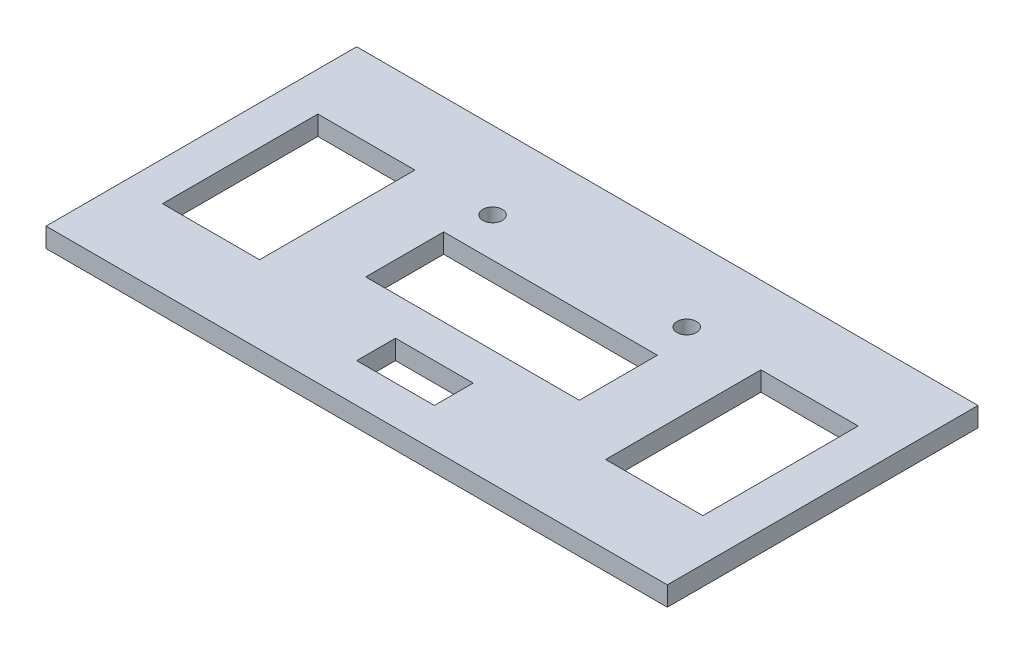
ISO-10303-21;
HEADER;
FILE_DESCRIPTION(('STEP AP214'),'2;1');
FILE_NAME('part.step','',(''),(''),'','','');
FILE_SCHEMA(('AUTOMOTIVE_DESIGN { 1 0 10303 214 1 1 1 1 }'));
ENDSEC;
DATA;
#1=APPLICATION_CONTEXT('core data for automotive mechanical design processes');
#2=APPLICATION_PROTOCOL_DEFINITION('international standard','automotive_design',2000,#1);
#3=PRODUCT_CONTEXT('',#1,'mechanical');
#4=PRODUCT('Part','Part','',(#3));
#5=PRODUCT_RELATED_PRODUCT_CATEGORY('part','',(#4));
#6=PRODUCT_DEFINITION_FORMATION('','',#4);
#7=PRODUCT_DEFINITION_CONTEXT('part definition',#1,'design');
#8=PRODUCT_DEFINITION('design','',#6,#7);
#9=PRODUCT_DEFINITION_SHAPE('','',#8);
#10=(LENGTH_UNIT() NAMED_UNIT(*) SI_UNIT(.MILLI.,.METRE.));
#11=(NAMED_UNIT(*) PLANE_ANGLE_UNIT() SI_UNIT($,.RADIAN.));
#12=(NAMED_UNIT(*) SI_UNIT($,.STERADIAN.) SOLID_ANGLE_UNIT());
#13=UNCERTAINTY_MEASURE_WITH_UNIT(LENGTH_MEASURE(1.E-05),#10,'distance_accuracy_value','');
#14=(GEOMETRIC_REPRESENTATION_CONTEXT(3) GLOBAL_UNCERTAINTY_ASSIGNED_CONTEXT((#13)) GLOBAL_UNIT_ASSIGNED_CONTEXT((#10,
#11,#12)) REPRESENTATION_CONTEXT('',''));
#15=CARTESIAN_POINT('',(0.,0.,0.));
#16=DIRECTION('',(0.,0.,1.));
#17=DIRECTION('',(1.,0.,0.));
#18=AXIS2_PLACEMENT_3D('',#15,#16,#17);
#19=CARTESIAN_POINT('',(0.,6.35,0.));
#20=DIRECTION('',(0.,-1.,0.));
#21=DIRECTION('',(0.,0.,-1.));
#22=AXIS2_PLACEMENT_3D('',#19,#20,#21);
#23=PLANE('',#22);
#24=DIRECTION('',(1.,0.,0.));
#25=VECTOR('',#24,1.);
#26=CARTESIAN_POINT('',(88.9,6.35,-12.7));
#27=LINE('',#26,#25);
#28=CARTESIAN_POINT('',(88.9,6.35,-12.7));
#29=VERTEX_POINT('',#28);
#30=CARTESIAN_POINT('',(114.3,6.35,-12.7));
#31=VERTEX_POINT('',#30);
#32=EDGE_CURVE('E183',#29,#31,#27,.T.);
#33=ORIENTED_EDGE('',*,*,#32,.F.);
#34=DIRECTION('',(0.,0.,1.));
#35=VECTOR('',#34,1.);
#36=CARTESIAN_POINT('',(88.9,6.35,-25.4));
#37=LINE('',#36,#35);
#38=CARTESIAN_POINT('',(88.9,6.35,-25.4));
#39=VERTEX_POINT('',#38);
#40=EDGE_CURVE('E50',#39,#29,#37,.T.);
#41=ORIENTED_EDGE('',*,*,#40,.F.);
#42=DIRECTION('',(-1.,0.,0.));
#43=VECTOR('',#42,1.);
#44=CARTESIAN_POINT('',(88.9,6.35,-25.4));
#45=LINE('',#44,#43);
#46=CARTESIAN_POINT('',(114.3,6.35,-25.4));
#47=VERTEX_POINT('',#46);
#48=EDGE_CURVE('E189',#47,#39,#45,.T.);
#49=ORIENTED_EDGE('',*,*,#48,.F.);
#50=DIRECTION('',(0.,0.,-1.));
#51=VECTOR('',#50,1.);
#52=CARTESIAN_POINT('',(114.3,6.35,-25.4));
#53=LINE('',#52,#51);
#54=EDGE_CURVE('E174',#31,#47,#53,.T.);
#55=ORIENTED_EDGE('',*,*,#54,.F.);
#56=EDGE_LOOP('',(#33,#41,#49,#55));
#57=FACE_BOUND('',#56,.T.);
#58=DIRECTION('',(1.,0.,0.));
#59=VECTOR('',#58,1.);
#60=CARTESIAN_POINT('',(66.6673608919091,6.35,-37.8867631456359));
#61=LINE('',#60,#59);
#62=CARTESIAN_POINT('',(66.6673608919091,6.35,-37.8867631456359));
#63=VERTEX_POINT('',#62);
#64=CARTESIAN_POINT('',(136.542227913672,6.35,-37.8867631456359));
#65=VERTEX_POINT('',#64);
#66=EDGE_CURVE('E200',#63,#65,#61,.T.);
#67=ORIENTED_EDGE('',*,*,#66,.F.);
#68=DIRECTION('',(0.,0.,1.));
#69=VECTOR('',#68,1.);
#70=CARTESIAN_POINT('',(66.6673608919091,6.35,-63.3958860848054));
#71=LINE('',#70,#69);
#72=CARTESIAN_POINT('',(66.6673608919091,6.35,-63.3958860848054));
#73=VERTEX_POINT('',#72);
#74=EDGE_CURVE('E196',#73,#63,#71,.T.);
#75=ORIENTED_EDGE('',*,*,#74,.F.);
#76=DIRECTION('',(1.,0.,0.));
#77=VECTOR('',#76,1.);
#78=CARTESIAN_POINT('',(66.6673608919091,6.35,-63.3958860848054));
#79=LINE('',#78,#77);
#80=CARTESIAN_POINT('',(136.542227913672,6.35,-63.3958860848054));
#81=VERTEX_POINT('',#80);
#82=EDGE_CURVE('E206',#73,#81,#79,.T.);
#83=ORIENTED_EDGE('',*,*,#82,.T.);
#84=DIRECTION('',(0.,0.,1.));
#85=VECTOR('',#84,1.);
#86=CARTESIAN_POINT('',(136.542227913672,6.35,-63.3958860848054));
#87=LINE('',#86,#85);
#88=EDGE_CURVE('E203',#81,#65,#87,.T.);
#89=ORIENTED_EDGE('',*,*,#88,.T.);
#90=EDGE_LOOP('',(#67,#75,#83,#89));
#91=FACE_BOUND('',#90,.T.);
#92=CARTESIAN_POINT('',(69.85,6.35,-76.2));
#93=DIRECTION('',(0.,1.,0.));
#94=DIRECTION('',(0.,0.,1.));
#95=AXIS2_PLACEMENT_3D('',#92,#93,#94);
#96=CIRCLE('',#95,3.175);
#97=CARTESIAN_POINT('',(69.85,6.35,-73.025));
#98=VERTEX_POINT('',#97);
#99=EDGE_CURVE('E219',#98,#98,#96,.T.);
#100=ORIENTED_EDGE('',*,*,#99,.F.);
#101=EDGE_LOOP('',(#100));
#102=FACE_BOUND('',#101,.T.);
#103=CARTESIAN_POINT('',(133.35,6.35,-76.2));
#104=DIRECTION('',(0.,1.,0.));
#105=DIRECTION('',(0.,0.,1.));
#106=AXIS2_PLACEMENT_3D('',#103,#104,#105);
#107=CIRCLE('',#106,3.175);
#108=CARTESIAN_POINT('',(133.35,6.35,-73.025));
#109=VERTEX_POINT('',#108);
#110=EDGE_CURVE('E212',#109,#109,#107,.T.);
#111=ORIENTED_EDGE('',*,*,#110,.F.);
#112=EDGE_LOOP('',(#111));
#113=FACE_BOUND('',#112,.T.);
#114=DIRECTION('',(0.,0.,1.));
#115=VECTOR('',#114,1.);
#116=CARTESIAN_POINT('',(12.7,6.35,-76.2));
#117=LINE('',#116,#115);
#118=CARTESIAN_POINT('',(12.7,6.35,-76.2));
#119=VERTEX_POINT('',#118);
#120=CARTESIAN_POINT('',(12.7,6.35,-25.4));
#121=VERTEX_POINT('',#120);
#122=EDGE_CURVE('E258',#119,#121,#117,.T.);
#123=ORIENTED_EDGE('',*,*,#122,.F.);
#124=DIRECTION('',(-1.,0.,0.));
#125=VECTOR('',#124,1.);
#126=CARTESIAN_POINT('',(12.7,6.35,-76.2));
#127=LINE('',#126,#125);
#128=CARTESIAN_POINT('',(44.45,6.35,-76.2));
#129=VERTEX_POINT('',#128);
#130=EDGE_CURVE('E266',#129,#119,#127,.T.);
#131=ORIENTED_EDGE('',*,*,#130,.F.);
#132=DIRECTION('',(0.,0.,-1.));
#133=VECTOR('',#132,1.);
#134=CARTESIAN_POINT('',(44.45,6.35,-76.2));
#135=LINE('',#134,#133);
#136=CARTESIAN_POINT('',(44.45,6.35,-25.4));
#137=VERTEX_POINT('',#136);
#138=EDGE_CURVE('E263',#137,#129,#135,.T.);
#139=ORIENTED_EDGE('',*,*,#138,.F.);
#140=DIRECTION('',(1.,0.,0.));
#141=VECTOR('',#140,1.);
#142=CARTESIAN_POINT('',(12.7,6.35,-25.4));
#143=LINE('',#142,#141);
#144=EDGE_CURVE('E260',#121,#137,#143,.T.);
#145=ORIENTED_EDGE('',*,*,#144,.F.);
#146=EDGE_LOOP('',(#123,#131,#139,#145));
#147=FACE_BOUND('',#146,.T.);
#148=DIRECTION('',(0.,0.,1.));
#149=VECTOR('',#148,1.);
#150=CARTESIAN_POINT('',(0.,6.35,0.));
#151=LINE('',#150,#149);
#152=CARTESIAN_POINT('',(0.,6.35,-101.6));
#153=VERTEX_POINT('',#152);
#154=CARTESIAN_POINT('',(0.,6.35,0.));
#155=VERTEX_POINT('',#154);
#156=EDGE_CURVE('E289',#153,#155,#151,.T.);
#157=ORIENTED_EDGE('',*,*,#156,.T.);
#158=DIRECTION('',(1.,0.,0.));
#159=VECTOR('',#158,1.);
#160=CARTESIAN_POINT('',(0.,6.35,0.));
#161=LINE('',#160,#159);
#162=CARTESIAN_POINT('',(203.2,6.35,0.));
#163=VERTEX_POINT('',#162);
#164=EDGE_CURVE('E292',#155,#163,#161,.T.);
#165=ORIENTED_EDGE('',*,*,#164,.T.);
#166=DIRECTION('',(0.,0.,-1.));
#167=VECTOR('',#166,1.);
#168=CARTESIAN_POINT('',(203.2,6.35,0.));
#169=LINE('',#168,#167);
#170=CARTESIAN_POINT('',(203.2,6.35,-101.6));
#171=VERTEX_POINT('',#170);
#172=EDGE_CURVE('E295',#163,#171,#169,.T.);
#173=ORIENTED_EDGE('',*,*,#172,.T.);
#174=DIRECTION('',(-1.,0.,0.));
#175=VECTOR('',#174,1.);
#176=CARTESIAN_POINT('',(0.,6.35,-101.6));
#177=LINE('',#176,#175);
#178=EDGE_CURVE('E297',#171,#153,#177,.T.);
#179=ORIENTED_EDGE('',*,*,#178,.T.);
#180=EDGE_LOOP('',(#157,#165,#173,#179));
#181=FACE_BOUND('',#180,.T.);
#182=DIRECTION('',(0.,0.,-1.));
#183=VECTOR('',#182,1.);
#184=CARTESIAN_POINT('',(189.416375643468,6.35,-76.2));
#185=LINE('',#184,#183);
#186=CARTESIAN_POINT('',(189.416375643468,6.35,-25.4));
#187=VERTEX_POINT('',#186);
#188=CARTESIAN_POINT('',(189.416375643468,6.35,-76.2));
#189=VERTEX_POINT('',#188);
#190=EDGE_CURVE('E225',#187,#189,#185,.T.);
#191=ORIENTED_EDGE('',*,*,#190,.F.);
#192=DIRECTION('',(1.,0.,0.));
#193=VECTOR('',#192,1.);
#194=CARTESIAN_POINT('',(189.416375643468,6.35,-25.4));
#195=LINE('',#194,#193);
#196=CARTESIAN_POINT('',(157.607444145469,6.35,-25.4));
#197=VERTEX_POINT('',#196);
#198=EDGE_CURVE('E233',#197,#187,#195,.T.);
#199=ORIENTED_EDGE('',*,*,#198,.F.);
#200=DIRECTION('',(0.,0.,1.));
#201=VECTOR('',#200,1.);
#202=CARTESIAN_POINT('',(157.607444145469,6.35,-76.2));
#203=LINE('',#202,#201);
#204=CARTESIAN_POINT('',(157.607444145469,6.35,-76.2));
#205=VERTEX_POINT('',#204);
#206=EDGE_CURVE('E230',#205,#197,#203,.T.);
#207=ORIENTED_EDGE('',*,*,#206,.F.);
#208=DIRECTION('',(-1.,0.,0.));
#209=VECTOR('',#208,1.);
#210=CARTESIAN_POINT('',(189.416375643468,6.35,-76.2));
#211=LINE('',#210,#209);
#212=EDGE_CURVE('E227',#189,#205,#211,.T.);
#213=ORIENTED_EDGE('',*,*,#212,.F.);
#214=EDGE_LOOP('',(#191,#199,#207,#213));
#215=FACE_BOUND('',#214,.T.);
#216=ADVANCED_FACE('F35',(#57,#91,#102,#113,#147,#181,#215),#23,.F.);
#217=CARTESIAN_POINT('',(0.,0.,0.));
#218=DIRECTION('',(0.,-1.,0.));
#219=DIRECTION('',(0.,0.,-1.));
#220=AXIS2_PLACEMENT_3D('',#217,#218,#219);
#221=PLANE('',#220);
#222=DIRECTION('',(0.,0.,-1.));
#223=VECTOR('',#222,1.);
#224=CARTESIAN_POINT('',(88.9,0.,0.));
#225=LINE('',#224,#223);
#226=CARTESIAN_POINT('',(88.9,0.,-12.7));
#227=VERTEX_POINT('',#226);
#228=CARTESIAN_POINT('',(88.9,0.,-25.4));
#229=VERTEX_POINT('',#228);
#230=EDGE_CURVE('E11',#227,#229,#225,.T.);
#231=ORIENTED_EDGE('',*,*,#230,.F.);
#232=DIRECTION('',(-1.,0.,0.));
#233=VECTOR('',#232,1.);
#234=CARTESIAN_POINT('',(0.,0.,-12.7));
#235=LINE('',#234,#233);
#236=CARTESIAN_POINT('',(114.3,0.,-12.7));
#237=VERTEX_POINT('',#236);
#238=EDGE_CURVE('E332',#237,#227,#235,.T.);
#239=ORIENTED_EDGE('',*,*,#238,.F.);
#240=DIRECTION('',(0.,0.,1.));
#241=VECTOR('',#240,1.);
#242=CARTESIAN_POINT('',(114.3,0.,0.));
#243=LINE('',#242,#241);
#244=CARTESIAN_POINT('',(114.3,0.,-25.4));
#245=VERTEX_POINT('',#244);
#246=EDGE_CURVE('E177',#245,#237,#243,.T.);
#247=ORIENTED_EDGE('',*,*,#246,.F.);
#248=DIRECTION('',(1.,0.,0.));
#249=VECTOR('',#248,1.);
#250=CARTESIAN_POINT('',(0.,0.,-25.4));
#251=LINE('',#250,#249);
#252=EDGE_CURVE('E43',#229,#245,#251,.T.);
#253=ORIENTED_EDGE('',*,*,#252,.F.);
#254=EDGE_LOOP('',(#231,#239,#247,#253));
#255=FACE_BOUND('',#254,.T.);
#256=DIRECTION('',(0.,0.,-1.));
#257=VECTOR('',#256,1.);
#258=CARTESIAN_POINT('',(66.6673608919091,0.,0.));
#259=LINE('',#258,#257);
#260=CARTESIAN_POINT('',(66.6673608919091,0.,-37.8867631456359));
#261=VERTEX_POINT('',#260);
#262=CARTESIAN_POINT('',(66.6673608919091,0.,-63.3958860848054));
#263=VERTEX_POINT('',#262);
#264=EDGE_CURVE('E330',#261,#263,#259,.T.);
#265=ORIENTED_EDGE('',*,*,#264,.F.);
#266=DIRECTION('',(-1.,0.,0.));
#267=VECTOR('',#266,1.);
#268=CARTESIAN_POINT('',(0.,0.,-37.8867631456359));
#269=LINE('',#268,#267);
#270=CARTESIAN_POINT('',(136.542227913672,0.,-37.8867631456359));
#271=VERTEX_POINT('',#270);
#272=EDGE_CURVE('E318',#271,#261,#269,.T.);
#273=ORIENTED_EDGE('',*,*,#272,.F.);
#274=DIRECTION('',(0.,0.,-1.));
#275=VECTOR('',#274,1.);
#276=CARTESIAN_POINT('',(136.542227913672,0.,0.));
#277=LINE('',#276,#275);
#278=CARTESIAN_POINT('',(136.542227913672,0.,-63.3958860848054));
#279=VERTEX_POINT('',#278);
#280=EDGE_CURVE('E324',#271,#279,#277,.T.);
#281=ORIENTED_EDGE('',*,*,#280,.T.);
#282=DIRECTION('',(-1.,0.,0.));
#283=VECTOR('',#282,1.);
#284=CARTESIAN_POINT('',(0.,0.,-63.3958860848054));
#285=LINE('',#284,#283);
#286=EDGE_CURVE('E327',#279,#263,#285,.T.);
#287=ORIENTED_EDGE('',*,*,#286,.T.);
#288=EDGE_LOOP('',(#265,#273,#281,#287));
#289=FACE_BOUND('',#288,.T.);
#290=CARTESIAN_POINT('',(69.85,0.,-76.2));
#291=DIRECTION('',(0.,-1.,0.));
#292=DIRECTION('',(0.,0.,-1.));
#293=AXIS2_PLACEMENT_3D('',#290,#291,#292);
#294=CIRCLE('',#293,3.175);
#295=CARTESIAN_POINT('',(69.85,0.,-79.375));
#296=VERTEX_POINT('',#295);
#297=EDGE_CURVE('E240',#296,#296,#294,.T.);
#298=ORIENTED_EDGE('',*,*,#297,.F.);
#299=EDGE_LOOP('',(#298));
#300=FACE_BOUND('',#299,.T.);
#301=CARTESIAN_POINT('',(133.35,0.,-76.2));
#302=DIRECTION('',(0.,-1.,0.));
#303=DIRECTION('',(0.,0.,-1.));
#304=AXIS2_PLACEMENT_3D('',#301,#302,#303);
#305=CIRCLE('',#304,3.175);
#306=CARTESIAN_POINT('',(133.35,0.,-79.375));
#307=VERTEX_POINT('',#306);
#308=EDGE_CURVE('E222',#307,#307,#305,.T.);
#309=ORIENTED_EDGE('',*,*,#308,.F.);
#310=EDGE_LOOP('',(#309));
#311=FACE_BOUND('',#310,.T.);
#312=DIRECTION('',(0.,0.,1.));
#313=VECTOR('',#312,1.);
#314=CARTESIAN_POINT('',(0.,0.,0.));
#315=LINE('',#314,#313);
#316=CARTESIAN_POINT('',(0.,0.,-101.6));
#317=VERTEX_POINT('',#316);
#318=CARTESIAN_POINT('',(0.,0.,0.));
#319=VERTEX_POINT('',#318);
#320=EDGE_CURVE('E288',#317,#319,#315,.T.);
#321=ORIENTED_EDGE('',*,*,#320,.F.);
#322=DIRECTION('',(-1.,0.,0.));
#323=VECTOR('',#322,1.);
#324=CARTESIAN_POINT('',(0.,0.,-101.6));
#325=LINE('',#324,#323);
#326=CARTESIAN_POINT('',(203.2,0.,-101.6));
#327=VERTEX_POINT('',#326);
#328=EDGE_CURVE('E293',#327,#317,#325,.T.);
#329=ORIENTED_EDGE('',*,*,#328,.F.);
#330=DIRECTION('',(0.,0.,-1.));
#331=VECTOR('',#330,1.);
#332=CARTESIAN_POINT('',(203.2,0.,0.));
#333=LINE('',#332,#331);
#334=CARTESIAN_POINT('',(203.2,0.,0.));
#335=VERTEX_POINT('',#334);
#336=EDGE_CURVE('E304',#335,#327,#333,.T.);
#337=ORIENTED_EDGE('',*,*,#336,.F.);
#338=DIRECTION('',(1.,0.,0.));
#339=VECTOR('',#338,1.);
#340=CARTESIAN_POINT('',(0.,0.,0.));
#341=LINE('',#340,#339);
#342=EDGE_CURVE('E302',#319,#335,#341,.T.);
#343=ORIENTED_EDGE('',*,*,#342,.F.);
#344=EDGE_LOOP('',(#321,#329,#337,#343));
#345=FACE_BOUND('',#344,.T.);
#346=DIRECTION('',(-1.,0.,0.));
#347=VECTOR('',#346,1.);
#348=CARTESIAN_POINT('',(12.7,0.,-76.2));
#349=LINE('',#348,#347);
#350=CARTESIAN_POINT('',(44.45,0.,-76.2));
#351=VERTEX_POINT('',#350);
#352=CARTESIAN_POINT('',(12.7,0.,-76.2));
#353=VERTEX_POINT('',#352);
#354=EDGE_CURVE('E261',#351,#353,#349,.T.);
#355=ORIENTED_EDGE('',*,*,#354,.T.);
#356=DIRECTION('',(0.,0.,1.));
#357=VECTOR('',#356,1.);
#358=CARTESIAN_POINT('',(12.7,0.,-76.2));
#359=LINE('',#358,#357);
#360=CARTESIAN_POINT('',(12.7,0.,-25.4));
#361=VERTEX_POINT('',#360);
#362=EDGE_CURVE('E257',#353,#361,#359,.T.);
#363=ORIENTED_EDGE('',*,*,#362,.T.);
#364=DIRECTION('',(1.,0.,0.));
#365=VECTOR('',#364,1.);
#366=CARTESIAN_POINT('',(12.7,0.,-25.4));
#367=LINE('',#366,#365);
#368=CARTESIAN_POINT('',(44.45,0.,-25.4));
#369=VERTEX_POINT('',#368);
#370=EDGE_CURVE('E271',#361,#369,#367,.T.);
#371=ORIENTED_EDGE('',*,*,#370,.T.);
#372=DIRECTION('',(0.,0.,-1.));
#373=VECTOR('',#372,1.);
#374=CARTESIAN_POINT('',(44.45,0.,-76.2));
#375=LINE('',#374,#373);
#376=EDGE_CURVE('E274',#369,#351,#375,.T.);
#377=ORIENTED_EDGE('',*,*,#376,.T.);
#378=EDGE_LOOP('',(#355,#363,#371,#377));
#379=FACE_BOUND('',#378,.T.);
#380=DIRECTION('',(1.,0.,0.));
#381=VECTOR('',#380,1.);
#382=CARTESIAN_POINT('',(189.416375643468,0.,-25.4));
#383=LINE('',#382,#381);
#384=CARTESIAN_POINT('',(157.607444145469,0.,-25.4));
#385=VERTEX_POINT('',#384);
#386=CARTESIAN_POINT('',(189.416375643468,0.,-25.4));
#387=VERTEX_POINT('',#386);
#388=EDGE_CURVE('E228',#385,#387,#383,.T.);
#389=ORIENTED_EDGE('',*,*,#388,.T.);
#390=DIRECTION('',(0.,0.,-1.));
#391=VECTOR('',#390,1.);
#392=CARTESIAN_POINT('',(189.416375643468,0.,-76.2));
#393=LINE('',#392,#391);
#394=CARTESIAN_POINT('',(189.416375643468,0.,-76.2));
#395=VERTEX_POINT('',#394);
#396=EDGE_CURVE('E236',#387,#395,#393,.T.);
#397=ORIENTED_EDGE('',*,*,#396,.T.);
#398=DIRECTION('',(-1.,0.,0.));
#399=VECTOR('',#398,1.);
#400=CARTESIAN_POINT('',(189.416375643468,0.,-76.2));
#401=LINE('',#400,#399);
#402=CARTESIAN_POINT('',(157.607444145469,0.,-76.2));
#403=VERTEX_POINT('',#402);
#404=EDGE_CURVE('E239',#395,#403,#401,.T.);
#405=ORIENTED_EDGE('',*,*,#404,.T.);
#406=DIRECTION('',(0.,0.,1.));
#407=VECTOR('',#406,1.);
#408=CARTESIAN_POINT('',(157.607444145469,0.,-76.2));
#409=LINE('',#408,#407);
#410=EDGE_CURVE('E243',#403,#385,#409,.T.);
#411=ORIENTED_EDGE('',*,*,#410,.T.);
#412=EDGE_LOOP('',(#389,#397,#405,#411));
#413=FACE_BOUND('',#412,.T.);
#414=ADVANCED_FACE('F340',(#255,#289,#300,#311,#345,#379,#413),#221,.T.);
#415=CARTESIAN_POINT('',(0.,6.35,0.));
#416=DIRECTION('',(1.,0.,0.));
#417=DIRECTION('',(0.,0.,-1.));
#418=AXIS2_PLACEMENT_3D('',#415,#416,#417);
#419=PLANE('',#418);
#420=ORIENTED_EDGE('',*,*,#320,.T.);
#421=DIRECTION('',(0.,-1.,0.));
#422=VECTOR('',#421,1.);
#423=CARTESIAN_POINT('',(0.,6.35,0.));
#424=LINE('',#423,#422);
#425=EDGE_CURVE('E315',#155,#319,#424,.T.);
#426=ORIENTED_EDGE('',*,*,#425,.F.);
#427=ORIENTED_EDGE('',*,*,#156,.F.);
#428=DIRECTION('',(0.,-1.,0.));
#429=VECTOR('',#428,1.);
#430=CARTESIAN_POINT('',(0.,6.35,-101.6));
#431=LINE('',#430,#429);
#432=EDGE_CURVE('E299',#153,#317,#431,.T.);
#433=ORIENTED_EDGE('',*,*,#432,.T.);
#434=EDGE_LOOP('',(#420,#426,#427,#433));
#435=FACE_BOUND('',#434,.T.);
#436=ADVANCED_FACE('F37',(#435),#419,.F.);
#437=CARTESIAN_POINT('',(0.,6.35,0.));
#438=DIRECTION('',(0.,0.,-1.));
#439=DIRECTION('',(-1.,0.,0.));
#440=AXIS2_PLACEMENT_3D('',#437,#438,#439);
#441=PLANE('',#440);
#442=ORIENTED_EDGE('',*,*,#342,.T.);
#443=DIRECTION('',(0.,-1.,0.));
#444=VECTOR('',#443,1.);
#445=CARTESIAN_POINT('',(203.2,6.35,0.));
#446=LINE('',#445,#444);
#447=EDGE_CURVE('E312',#163,#335,#446,.T.);
#448=ORIENTED_EDGE('',*,*,#447,.F.);
#449=ORIENTED_EDGE('',*,*,#164,.F.);
#450=ORIENTED_EDGE('',*,*,#425,.T.);
#451=EDGE_LOOP('',(#442,#448,#449,#450));
#452=FACE_BOUND('',#451,.T.);
#453=ADVANCED_FACE('F372',(#452),#441,.F.);
#454=CARTESIAN_POINT('',(203.2,6.35,0.));
#455=DIRECTION('',(-1.,0.,0.));
#456=DIRECTION('',(0.,0.,1.));
#457=AXIS2_PLACEMENT_3D('',#454,#455,#456);
#458=PLANE('',#457);
#459=ORIENTED_EDGE('',*,*,#336,.T.);
#460=DIRECTION('',(0.,-1.,0.));
#461=VECTOR('',#460,1.);
#462=CARTESIAN_POINT('',(203.2,6.35,-101.6));
#463=LINE('',#462,#461);
#464=EDGE_CURVE('E309',#171,#327,#463,.T.);
#465=ORIENTED_EDGE('',*,*,#464,.F.);
#466=ORIENTED_EDGE('',*,*,#172,.F.);
#467=ORIENTED_EDGE('',*,*,#447,.T.);
#468=EDGE_LOOP('',(#459,#465,#466,#467));
#469=FACE_BOUND('',#468,.T.);
#470=ADVANCED_FACE('F369',(#469),#458,.F.);
#471=CARTESIAN_POINT('',(0.,6.35,-101.6));
#472=DIRECTION('',(0.,0.,1.));
#473=DIRECTION('',(1.,0.,0.));
#474=AXIS2_PLACEMENT_3D('',#471,#472,#473);
#475=PLANE('',#474);
#476=ORIENTED_EDGE('',*,*,#328,.T.);
#477=ORIENTED_EDGE('',*,*,#432,.F.);
#478=ORIENTED_EDGE('',*,*,#178,.F.);
#479=ORIENTED_EDGE('',*,*,#464,.T.);
#480=EDGE_LOOP('',(#476,#477,#478,#479));
#481=FACE_BOUND('',#480,.T.);
#482=ADVANCED_FACE('F366',(#481),#475,.F.);
#483=CARTESIAN_POINT('',(12.7,6.35,-76.2));
#484=DIRECTION('',(1.,0.,0.));
#485=DIRECTION('',(0.,0.,-1.));
#486=AXIS2_PLACEMENT_3D('',#483,#484,#485);
#487=PLANE('',#486);
#488=ORIENTED_EDGE('',*,*,#362,.F.);
#489=DIRECTION('',(0.,-1.,0.));
#490=VECTOR('',#489,1.);
#491=CARTESIAN_POINT('',(12.7,6.35,-76.2));
#492=LINE('',#491,#490);
#493=EDGE_CURVE('E268',#119,#353,#492,.T.);
#494=ORIENTED_EDGE('',*,*,#493,.F.);
#495=ORIENTED_EDGE('',*,*,#122,.T.);
#496=DIRECTION('',(0.,-1.,0.));
#497=VECTOR('',#496,1.);
#498=CARTESIAN_POINT('',(12.7,6.35,-25.4));
#499=LINE('',#498,#497);
#500=EDGE_CURVE('E285',#121,#361,#499,.T.);
#501=ORIENTED_EDGE('',*,*,#500,.T.);
#502=EDGE_LOOP('',(#488,#494,#495,#501));
#503=FACE_BOUND('',#502,.T.);
#504=ADVANCED_FACE('F363',(#503),#487,.T.);
#505=CARTESIAN_POINT('',(12.7,6.35,-25.4));
#506=DIRECTION('',(0.,0.,-1.));
#507=DIRECTION('',(-1.,0.,0.));
#508=AXIS2_PLACEMENT_3D('',#505,#506,#507);
#509=PLANE('',#508);
#510=ORIENTED_EDGE('',*,*,#370,.F.);
#511=ORIENTED_EDGE('',*,*,#500,.F.);
#512=ORIENTED_EDGE('',*,*,#144,.T.);
#513=DIRECTION('',(0.,-1.,0.));
#514=VECTOR('',#513,1.);
#515=CARTESIAN_POINT('',(44.45,6.35,-25.4));
#516=LINE('',#515,#514);
#517=EDGE_CURVE('E283',#137,#369,#516,.T.);
#518=ORIENTED_EDGE('',*,*,#517,.T.);
#519=EDGE_LOOP('',(#510,#511,#512,#518));
#520=FACE_BOUND('',#519,.T.);
#521=ADVANCED_FACE('F431',(#520),#509,.T.);
#522=CARTESIAN_POINT('',(44.45,6.35,-76.2));
#523=DIRECTION('',(-1.,0.,0.));
#524=DIRECTION('',(0.,0.,1.));
#525=AXIS2_PLACEMENT_3D('',#522,#523,#524);
#526=PLANE('',#525);
#527=ORIENTED_EDGE('',*,*,#376,.F.);
#528=ORIENTED_EDGE('',*,*,#517,.F.);
#529=ORIENTED_EDGE('',*,*,#138,.T.);
#530=DIRECTION('',(0.,-1.,0.));
#531=VECTOR('',#530,1.);
#532=CARTESIAN_POINT('',(44.45,6.35,-76.2));
#533=LINE('',#532,#531);
#534=EDGE_CURVE('E281',#129,#351,#533,.T.);
#535=ORIENTED_EDGE('',*,*,#534,.T.);
#536=EDGE_LOOP('',(#527,#528,#529,#535));
#537=FACE_BOUND('',#536,.T.);
#538=ADVANCED_FACE('F428',(#537),#526,.T.);
#539=CARTESIAN_POINT('',(12.7,6.35,-76.2));
#540=DIRECTION('',(0.,0.,1.));
#541=DIRECTION('',(1.,0.,0.));
#542=AXIS2_PLACEMENT_3D('',#539,#540,#541);
#543=PLANE('',#542);
#544=ORIENTED_EDGE('',*,*,#354,.F.);
#545=ORIENTED_EDGE('',*,*,#534,.F.);
#546=ORIENTED_EDGE('',*,*,#130,.T.);
#547=ORIENTED_EDGE('',*,*,#493,.T.);
#548=EDGE_LOOP('',(#544,#545,#546,#547));
#549=FACE_BOUND('',#548,.T.);
#550=ADVANCED_FACE('F425',(#549),#543,.T.);
#551=CARTESIAN_POINT('',(189.416375643468,6.35,-76.2));
#552=DIRECTION('',(-1.,0.,0.));
#553=DIRECTION('',(0.,0.,1.));
#554=AXIS2_PLACEMENT_3D('',#551,#552,#553);
#555=PLANE('',#554);
#556=ORIENTED_EDGE('',*,*,#396,.F.);
#557=DIRECTION('',(0.,-1.,0.));
#558=VECTOR('',#557,1.);
#559=CARTESIAN_POINT('',(189.416375643468,6.35,-25.4));
#560=LINE('',#559,#558);
#561=EDGE_CURVE('E235',#187,#387,#560,.T.);
#562=ORIENTED_EDGE('',*,*,#561,.F.);
#563=ORIENTED_EDGE('',*,*,#190,.T.);
#564=DIRECTION('',(0.,-1.,0.));
#565=VECTOR('',#564,1.);
#566=CARTESIAN_POINT('',(189.416375643468,6.35,-76.2));
#567=LINE('',#566,#565);
#568=EDGE_CURVE('E254',#189,#395,#567,.T.);
#569=ORIENTED_EDGE('',*,*,#568,.T.);
#570=EDGE_LOOP('',(#556,#562,#563,#569));
#571=FACE_BOUND('',#570,.T.);
#572=ADVANCED_FACE('F401',(#571),#555,.T.);
#573=CARTESIAN_POINT('',(189.416375643468,6.35,-76.2));
#574=DIRECTION('',(0.,0.,1.));
#575=DIRECTION('',(1.,0.,0.));
#576=AXIS2_PLACEMENT_3D('',#573,#574,#575);
#577=PLANE('',#576);
#578=ORIENTED_EDGE('',*,*,#404,.F.);
#579=ORIENTED_EDGE('',*,*,#568,.F.);
#580=ORIENTED_EDGE('',*,*,#212,.T.);
#581=DIRECTION('',(0.,-1.,0.));
#582=VECTOR('',#581,1.);
#583=CARTESIAN_POINT('',(157.607444145469,6.35,-76.2));
#584=LINE('',#583,#582);
#585=EDGE_CURVE('E252',#205,#403,#584,.T.);
#586=ORIENTED_EDGE('',*,*,#585,.T.);
#587=EDGE_LOOP('',(#578,#579,#580,#586));
#588=FACE_BOUND('',#587,.T.);
#589=ADVANCED_FACE('F403',(#588),#577,.T.);
#590=CARTESIAN_POINT('',(157.607444145469,6.35,-76.2));
#591=DIRECTION('',(1.,0.,0.));
#592=DIRECTION('',(0.,0.,-1.));
#593=AXIS2_PLACEMENT_3D('',#590,#591,#592);
#594=PLANE('',#593);
#595=ORIENTED_EDGE('',*,*,#410,.F.);
#596=ORIENTED_EDGE('',*,*,#585,.F.);
#597=ORIENTED_EDGE('',*,*,#206,.T.);
#598=DIRECTION('',(0.,-1.,0.));
#599=VECTOR('',#598,1.);
#600=CARTESIAN_POINT('',(157.607444145469,6.35,-25.4));
#601=LINE('',#600,#599);
#602=EDGE_CURVE('E250',#197,#385,#601,.T.);
#603=ORIENTED_EDGE('',*,*,#602,.T.);
#604=EDGE_LOOP('',(#595,#596,#597,#603));
#605=FACE_BOUND('',#604,.T.);
#606=ADVANCED_FACE('F411',(#605),#594,.T.);
#607=CARTESIAN_POINT('',(189.416375643468,6.35,-25.4));
#608=DIRECTION('',(0.,0.,-1.));
#609=DIRECTION('',(-1.,0.,0.));
#610=AXIS2_PLACEMENT_3D('',#607,#608,#609);
#611=PLANE('',#610);
#612=ORIENTED_EDGE('',*,*,#388,.F.);
#613=ORIENTED_EDGE('',*,*,#602,.F.);
#614=ORIENTED_EDGE('',*,*,#198,.T.);
#615=ORIENTED_EDGE('',*,*,#561,.T.);
#616=EDGE_LOOP('',(#612,#613,#614,#615));
#617=FACE_BOUND('',#616,.T.);
#618=ADVANCED_FACE('F409',(#617),#611,.T.);
#619=CARTESIAN_POINT('',(133.35,-28.194,-76.2));
#620=DIRECTION('',(0.,1.,0.));
#621=DIRECTION('',(0.,0.,1.));
#622=AXIS2_PLACEMENT_3D('',#619,#620,#621);
#623=CYLINDRICAL_SURFACE('',#622,3.175);
#624=ORIENTED_EDGE('',*,*,#308,.T.);
#625=EDGE_LOOP('',(#624));
#626=FACE_BOUND('',#625,.T.);
#627=ORIENTED_EDGE('',*,*,#110,.T.);
#628=EDGE_LOOP('',(#627));
#629=FACE_BOUND('',#628,.T.);
#630=ADVANCED_FACE('F418',(#626,#629),#623,.F.);
#631=CARTESIAN_POINT('',(69.85,-28.194,-76.2));
#632=DIRECTION('',(0.,1.,0.));
#633=DIRECTION('',(0.,0.,1.));
#634=AXIS2_PLACEMENT_3D('',#631,#632,#633);
#635=CYLINDRICAL_SURFACE('',#634,3.175);
#636=ORIENTED_EDGE('',*,*,#297,.T.);
#637=EDGE_LOOP('',(#636));
#638=FACE_BOUND('',#637,.T.);
#639=ORIENTED_EDGE('',*,*,#99,.T.);
#640=EDGE_LOOP('',(#639));
#641=FACE_BOUND('',#640,.T.);
#642=ADVANCED_FACE('F534',(#638,#641),#635,.F.);
#643=CARTESIAN_POINT('',(66.6673608919091,-28.194,-63.3958860848054));
#644=DIRECTION('',(-1.,0.,0.));
#645=DIRECTION('',(0.,0.,1.));
#646=AXIS2_PLACEMENT_3D('',#643,#644,#645);
#647=PLANE('',#646);
#648=ORIENTED_EDGE('',*,*,#264,.T.);
#649=DIRECTION('',(0.,1.,0.));
#650=VECTOR('',#649,1.);
#651=CARTESIAN_POINT('',(66.6673608919091,-28.194,-63.3958860848054));
#652=LINE('',#651,#650);
#653=EDGE_CURVE('E210',#263,#73,#652,.T.);
#654=ORIENTED_EDGE('',*,*,#653,.T.);
#655=ORIENTED_EDGE('',*,*,#74,.T.);
#656=DIRECTION('',(0.,1.,0.));
#657=VECTOR('',#656,1.);
#658=CARTESIAN_POINT('',(66.6673608919091,-28.194,-37.8867631456359));
#659=LINE('',#658,#657);
#660=EDGE_CURVE('E209',#261,#63,#659,.T.);
#661=ORIENTED_EDGE('',*,*,#660,.F.);
#662=EDGE_LOOP('',(#648,#654,#655,#661));
#663=FACE_BOUND('',#662,.T.);
#664=ADVANCED_FACE('F526',(#663),#647,.F.);
#665=CARTESIAN_POINT('',(66.6673608919091,-28.194,-63.3958860848054));
#666=DIRECTION('',(0.,0.,1.));
#667=DIRECTION('',(1.,0.,0.));
#668=AXIS2_PLACEMENT_3D('',#665,#666,#667);
#669=PLANE('',#668);
#670=DIRECTION('',(0.,1.,0.));
#671=VECTOR('',#670,1.);
#672=CARTESIAN_POINT('',(136.542227913672,-28.194,-63.3958860848054));
#673=LINE('',#672,#671);
#674=EDGE_CURVE('E213',#279,#81,#673,.T.);
#675=ORIENTED_EDGE('',*,*,#674,.T.);
#676=ORIENTED_EDGE('',*,*,#82,.F.);
#677=ORIENTED_EDGE('',*,*,#653,.F.);
#678=ORIENTED_EDGE('',*,*,#286,.F.);
#679=EDGE_LOOP('',(#675,#676,#677,#678));
#680=FACE_BOUND('',#679,.T.);
#681=ADVANCED_FACE('F517',(#680),#669,.T.);
#682=CARTESIAN_POINT('',(136.542227913672,-28.194,-63.3958860848054));
#683=DIRECTION('',(-1.,0.,0.));
#684=DIRECTION('',(0.,0.,1.));
#685=AXIS2_PLACEMENT_3D('',#682,#683,#684);
#686=PLANE('',#685);
#687=DIRECTION('',(0.,1.,0.));
#688=VECTOR('',#687,1.);
#689=CARTESIAN_POINT('',(136.542227913672,-28.194,-37.8867631456359));
#690=LINE('',#689,#688);
#691=EDGE_CURVE('E215',#271,#65,#690,.T.);
#692=ORIENTED_EDGE('',*,*,#691,.T.);
#693=ORIENTED_EDGE('',*,*,#88,.F.);
#694=ORIENTED_EDGE('',*,*,#674,.F.);
#695=ORIENTED_EDGE('',*,*,#280,.F.);
#696=EDGE_LOOP('',(#692,#693,#694,#695));
#697=FACE_BOUND('',#696,.T.);
#698=ADVANCED_FACE('F351',(#697),#686,.T.);
#699=CARTESIAN_POINT('',(66.6673608919091,-28.194,-37.8867631456359));
#700=DIRECTION('',(0.,0.,1.));
#701=DIRECTION('',(1.,0.,0.));
#702=AXIS2_PLACEMENT_3D('',#699,#700,#701);
#703=PLANE('',#702);
#704=ORIENTED_EDGE('',*,*,#272,.T.);
#705=ORIENTED_EDGE('',*,*,#660,.T.);
#706=ORIENTED_EDGE('',*,*,#66,.T.);
#707=ORIENTED_EDGE('',*,*,#691,.F.);
#708=EDGE_LOOP('',(#704,#705,#706,#707));
#709=FACE_BOUND('',#708,.T.);
#710=ADVANCED_FACE('F344',(#709),#703,.F.);
#711=CARTESIAN_POINT('',(88.9,-28.194,-25.4));
#712=DIRECTION('',(-1.,0.,0.));
#713=DIRECTION('',(0.,0.,1.));
#714=AXIS2_PLACEMENT_3D('',#711,#712,#713);
#715=PLANE('',#714);
#716=ORIENTED_EDGE('',*,*,#230,.T.);
#717=DIRECTION('',(0.,1.,0.));
#718=VECTOR('',#717,1.);
#719=CARTESIAN_POINT('',(88.9,-28.194,-25.4));
#720=LINE('',#719,#718);
#721=EDGE_CURVE('E194',#229,#39,#720,.T.);
#722=ORIENTED_EDGE('',*,*,#721,.T.);
#723=ORIENTED_EDGE('',*,*,#40,.T.);
#724=DIRECTION('',(0.,1.,0.));
#725=VECTOR('',#724,1.);
#726=CARTESIAN_POINT('',(88.9,-28.194,-12.7));
#727=LINE('',#726,#725);
#728=EDGE_CURVE('E180',#227,#29,#727,.T.);
#729=ORIENTED_EDGE('',*,*,#728,.F.);
#730=EDGE_LOOP('',(#716,#722,#723,#729));
#731=FACE_BOUND('',#730,.T.);
#732=ADVANCED_FACE('F342',(#731),#715,.F.);
#733=CARTESIAN_POINT('',(88.9,-28.194,-25.4));
#734=DIRECTION('',(0.,0.,-1.));
#735=DIRECTION('',(-1.,0.,0.));
#736=AXIS2_PLACEMENT_3D('',#733,#734,#735);
#737=PLANE('',#736);
#738=ORIENTED_EDGE('',*,*,#252,.T.);
#739=DIRECTION('',(0.,1.,0.));
#740=VECTOR('',#739,1.);
#741=CARTESIAN_POINT('',(114.3,-28.194,-25.4));
#742=LINE('',#741,#740);
#743=EDGE_CURVE('E179',#245,#47,#742,.T.);
#744=ORIENTED_EDGE('',*,*,#743,.T.);
#745=ORIENTED_EDGE('',*,*,#48,.T.);
#746=ORIENTED_EDGE('',*,*,#721,.F.);
#747=EDGE_LOOP('',(#738,#744,#745,#746));
#748=FACE_BOUND('',#747,.T.);
#749=ADVANCED_FACE('F337',(#748),#737,.F.);
#750=CARTESIAN_POINT('',(114.3,-28.194,-25.4));
#751=DIRECTION('',(1.,0.,0.));
#752=DIRECTION('',(0.,0.,-1.));
#753=AXIS2_PLACEMENT_3D('',#750,#751,#752);
#754=PLANE('',#753);
#755=ORIENTED_EDGE('',*,*,#246,.T.);
#756=DIRECTION('',(0.,1.,0.));
#757=VECTOR('',#756,1.);
#758=CARTESIAN_POINT('',(114.3,-28.194,-12.7));
#759=LINE('',#758,#757);
#760=EDGE_CURVE('E58',#237,#31,#759,.T.);
#761=ORIENTED_EDGE('',*,*,#760,.T.);
#762=ORIENTED_EDGE('',*,*,#54,.T.);
#763=ORIENTED_EDGE('',*,*,#743,.F.);
#764=EDGE_LOOP('',(#755,#761,#762,#763));
#765=FACE_BOUND('',#764,.T.);
#766=ADVANCED_FACE('F171',(#765),#754,.F.);
#767=CARTESIAN_POINT('',(88.9,-28.194,-12.7));
#768=DIRECTION('',(0.,0.,1.));
#769=DIRECTION('',(1.,0.,0.));
#770=AXIS2_PLACEMENT_3D('',#767,#768,#769);
#771=PLANE('',#770);
#772=ORIENTED_EDGE('',*,*,#238,.T.);
#773=ORIENTED_EDGE('',*,*,#728,.T.);
#774=ORIENTED_EDGE('',*,*,#32,.T.);
#775=ORIENTED_EDGE('',*,*,#760,.F.);
#776=EDGE_LOOP('',(#772,#773,#774,#775));
#777=FACE_BOUND('',#776,.T.);
#778=ADVANCED_FACE('F184',(#777),#771,.F.);
#779=CLOSED_SHELL('',(#216,#414,#436,#453,#470,#482,#504,#521,#538,#550,#572,#589,#606,#618,
#630,#642,#664,#681,#698,#710,#732,#749,#766,#778));
#780=MANIFOLD_SOLID_BREP('B2',#779);
#781=ADVANCED_BREP_SHAPE_REPRESENTATION('',(#18,#780),#14);
#782=SHAPE_DEFINITION_REPRESENTATION(#9,#781);
ENDSEC;
END-ISO-10303-21;
